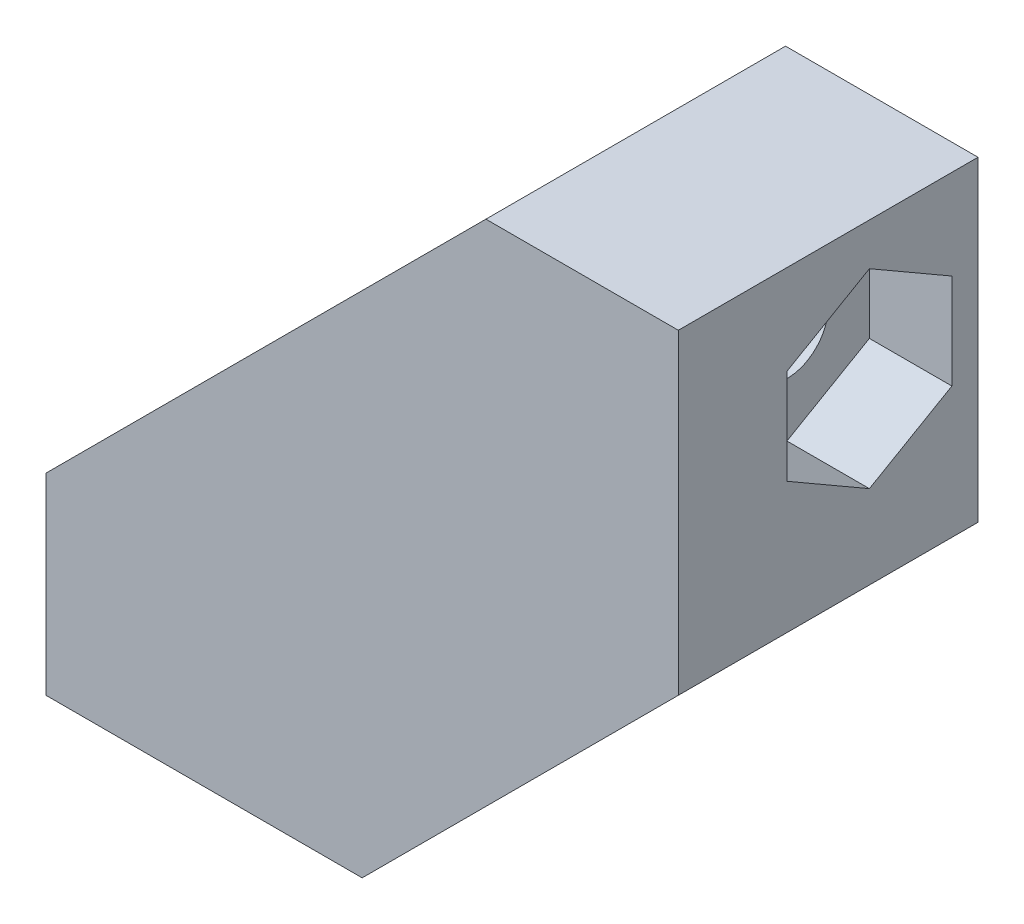
ISO-10303-21;
HEADER;
FILE_DESCRIPTION(('STEP AP214'),'2;1');
FILE_NAME('part.step','',(''),(''),'','','');
FILE_SCHEMA(('AUTOMOTIVE_DESIGN { 1 0 10303 214 1 1 1 1 }'));
ENDSEC;
DATA;
#1=APPLICATION_CONTEXT('core data for automotive mechanical design processes');
#2=APPLICATION_PROTOCOL_DEFINITION('international standard','automotive_design',2000,#1);
#3=PRODUCT_CONTEXT('',#1,'mechanical');
#4=PRODUCT('Part','Part','',(#3));
#5=PRODUCT_RELATED_PRODUCT_CATEGORY('part','',(#4));
#6=PRODUCT_DEFINITION_FORMATION('','',#4);
#7=PRODUCT_DEFINITION_CONTEXT('part definition',#1,'design');
#8=PRODUCT_DEFINITION('design','',#6,#7);
#9=PRODUCT_DEFINITION_SHAPE('','',#8);
#10=(LENGTH_UNIT() NAMED_UNIT(*) SI_UNIT(.MILLI.,.METRE.));
#11=(NAMED_UNIT(*) PLANE_ANGLE_UNIT() SI_UNIT($,.RADIAN.));
#12=(NAMED_UNIT(*) SI_UNIT($,.STERADIAN.) SOLID_ANGLE_UNIT());
#13=UNCERTAINTY_MEASURE_WITH_UNIT(LENGTH_MEASURE(1.E-05),#10,'distance_accuracy_value','');
#14=(GEOMETRIC_REPRESENTATION_CONTEXT(3) GLOBAL_UNCERTAINTY_ASSIGNED_CONTEXT((#13)) GLOBAL_UNIT_ASSIGNED_CONTEXT((#10,
#11,#12)) REPRESENTATION_CONTEXT('',''));
#15=CARTESIAN_POINT('',(0.,0.,0.));
#16=DIRECTION('',(0.,0.,1.));
#17=DIRECTION('',(1.,0.,0.));
#18=AXIS2_PLACEMENT_3D('',#15,#16,#17);
#19=CARTESIAN_POINT('',(22.,11.,-3.95));
#20=DIRECTION('',(1.,0.,0.));
#21=DIRECTION('',(0.,1.,0.));
#22=AXIS2_PLACEMENT_3D('',#19,#20,#21);
#23=CYLINDRICAL_SURFACE('',#22,1.5);
#24=CARTESIAN_POINT('',(38.,11.,-3.95));
#25=DIRECTION('',(1.,0.,0.));
#26=DIRECTION('',(0.,0.,-1.));
#27=AXIS2_PLACEMENT_3D('',#24,#25,#26);
#28=CIRCLE('',#27,1.5);
#29=CARTESIAN_POINT('',(38.,12.5,-3.95));
#30=VERTEX_POINT('',#29);
#31=EDGE_CURVE('E275',#30,#30,#28,.F.);
#32=CARTESIAN_POINT('',(42.,11.,-3.95));
#33=DIRECTION('',(1.,0.,0.));
#34=DIRECTION('',(0.,1.,0.));
#35=AXIS2_PLACEMENT_3D('',#32,#33,#34);
#36=CIRCLE('',#35,1.5);
#37=CARTESIAN_POINT('',(42.,12.5,-3.95));
#38=VERTEX_POINT('',#37);
#39=EDGE_CURVE('E270',#38,#38,#36,.T.);
#40=CARTESIAN_POINT('',(38.,12.5,-3.95));
#41=CARTESIAN_POINT('',(38.0416666666667,12.5,-3.95));
#42=CARTESIAN_POINT('',(38.0833333333333,12.5,-3.95));
#43=CARTESIAN_POINT('',(38.1666666666667,12.5,-3.95));
#44=CARTESIAN_POINT('',(38.2083333333333,12.5,-3.95));
#45=CARTESIAN_POINT('',(38.2916666666667,12.5,-3.95));
#46=CARTESIAN_POINT('',(38.3333333333333,12.5,-3.95));
#47=CARTESIAN_POINT('',(38.4166666666667,12.5,-3.95));
#48=CARTESIAN_POINT('',(38.4583333333333,12.5,-3.95));
#49=CARTESIAN_POINT('',(38.5416666666667,12.5,-3.95));
#50=CARTESIAN_POINT('',(38.5833333333333,12.5,-3.95));
#51=CARTESIAN_POINT('',(38.6666666666667,12.5,-3.95));
#52=CARTESIAN_POINT('',(38.7083333333333,12.5,-3.95));
#53=CARTESIAN_POINT('',(38.7916666666667,12.5,-3.95));
#54=CARTESIAN_POINT('',(38.8333333333333,12.5,-3.95));
#55=CARTESIAN_POINT('',(38.9166666666667,12.5,-3.95));
#56=CARTESIAN_POINT('',(38.9583333333333,12.5,-3.95));
#57=CARTESIAN_POINT('',(39.0416666666667,12.5,-3.95));
#58=CARTESIAN_POINT('',(39.0833333333333,12.5,-3.95));
#59=CARTESIAN_POINT('',(39.1666666666667,12.5,-3.95));
#60=CARTESIAN_POINT('',(39.2083333333333,12.5,-3.95));
#61=CARTESIAN_POINT('',(39.2916666666667,12.5,-3.95));
#62=CARTESIAN_POINT('',(39.3333333333333,12.5,-3.95));
#63=CARTESIAN_POINT('',(39.4166666666667,12.5,-3.95));
#64=CARTESIAN_POINT('',(39.4583333333333,12.5,-3.95));
#65=CARTESIAN_POINT('',(39.5416666666667,12.5,-3.95));
#66=CARTESIAN_POINT('',(39.5833333333333,12.5,-3.95));
#67=CARTESIAN_POINT('',(39.6666666666667,12.5,-3.95));
#68=CARTESIAN_POINT('',(39.7083333333333,12.5,-3.95));
#69=CARTESIAN_POINT('',(39.7916666666667,12.5,-3.95));
#70=CARTESIAN_POINT('',(39.8333333333333,12.5,-3.95));
#71=CARTESIAN_POINT('',(39.9166666666667,12.5,-3.95));
#72=CARTESIAN_POINT('',(39.9583333333333,12.5,-3.95));
#73=CARTESIAN_POINT('',(40.0416666666667,12.5,-3.95));
#74=CARTESIAN_POINT('',(40.0833333333333,12.5,-3.95));
#75=CARTESIAN_POINT('',(40.1666666666667,12.5,-3.95));
#76=CARTESIAN_POINT('',(40.2083333333333,12.5,-3.95));
#77=CARTESIAN_POINT('',(40.2916666666667,12.5,-3.95));
#78=CARTESIAN_POINT('',(40.3333333333333,12.5,-3.95));
#79=CARTESIAN_POINT('',(40.4166666666667,12.5,-3.95));
#80=CARTESIAN_POINT('',(40.4583333333333,12.5,-3.95));
#81=CARTESIAN_POINT('',(40.5416666666667,12.5,-3.95));
#82=CARTESIAN_POINT('',(40.5833333333333,12.5,-3.95));
#83=CARTESIAN_POINT('',(40.6666666666667,12.5,-3.95));
#84=CARTESIAN_POINT('',(40.7083333333333,12.5,-3.95));
#85=CARTESIAN_POINT('',(40.7916666666667,12.5,-3.95));
#86=CARTESIAN_POINT('',(40.8333333333333,12.5,-3.95));
#87=CARTESIAN_POINT('',(40.9166666666667,12.5,-3.95));
#88=CARTESIAN_POINT('',(40.9583333333333,12.5,-3.95));
#89=CARTESIAN_POINT('',(41.0416666666667,12.5,-3.95));
#90=CARTESIAN_POINT('',(41.0833333333333,12.5,-3.95));
#91=CARTESIAN_POINT('',(41.1666666666667,12.5,-3.95));
#92=CARTESIAN_POINT('',(41.2083333333333,12.5,-3.95));
#93=CARTESIAN_POINT('',(41.2916666666667,12.5,-3.95));
#94=CARTESIAN_POINT('',(41.3333333333333,12.5,-3.95));
#95=CARTESIAN_POINT('',(41.4166666666667,12.5,-3.95));
#96=CARTESIAN_POINT('',(41.4583333333333,12.5,-3.95));
#97=CARTESIAN_POINT('',(41.5416666666667,12.5,-3.95));
#98=CARTESIAN_POINT('',(41.5833333333333,12.5,-3.95));
#99=CARTESIAN_POINT('',(41.6666666666666,12.5,-3.95));
#100=CARTESIAN_POINT('',(41.7083333333333,12.5,-3.95));
#101=CARTESIAN_POINT('',(41.7916666666666,12.5,-3.95));
#102=CARTESIAN_POINT('',(41.8333333333333,12.5,-3.95));
#103=CARTESIAN_POINT('',(41.9166666666666,12.5,-3.95));
#104=CARTESIAN_POINT('',(41.9583333333333,12.5,-3.95));
#105=CARTESIAN_POINT('',(42.,12.5,-3.95));
#106=B_SPLINE_CURVE_WITH_KNOTS('',3,(#40,#41,#42,#43,#44,#45,#46,#47,#48,#49,#50,#51,#52,#53,
#54,#55,#56,#57,#58,#59,#60,#61,#62,#63,#64,#65,#66,#67,#68,#69,#70,#71,#72,#73,#74,#75,#76,#77,
#78,#79,#80,#81,#82,#83,#84,#85,#86,#87,#88,#89,#90,#91,#92,#93,#94,#95,#96,#97,#98,#99,#100,
#101,#102,#103,#104,#105),.UNSPECIFIED.,.F.,.F.,(4,2,2,2,2,2,2,2,2,2,2,2,2,2,2,2,2,2,2,2,2,2,2,
2,2,2,2,2,2,2,2,2,4),(0.,0.125,0.25,0.374999999999993,0.499999999999994,0.624999999999994,
0.749999999999994,0.874999999999994,0.999999999999994,1.12499999999999,1.24999999999999,
1.37499999999999,1.49999999999999,1.62499999999999,1.74999999999999,1.87499999999999,
1.99999999999999,2.12499999999999,2.24999999999999,2.37499999999998,2.49999999999998,
2.62499999999998,2.74999999999998,2.87499999999998,2.99999999999998,3.12499999999998,
3.24999999999998,3.37499999999998,3.49999999999998,3.62499999999998,3.74999999999998,
3.87499999999998,3.99999999999998),.UNSPECIFIED.);
#107=EDGE_CURVE('BSEAM36',#30,#38,#106,.T.);
#108=ORIENTED_EDGE('',*,*,#31,.T.);
#109=ORIENTED_EDGE('',*,*,#39,.T.);
#110=ORIENTED_EDGE('',*,*,#107,.T.);
#111=ORIENTED_EDGE('',*,*,#107,.F.);
#112=EDGE_LOOP('',(#108,#110,#109,#111));
#113=FACE_BOUND('',#112,.T.);
#114=ADVANCED_FACE('F36',(#113),#23,.F.);
#115=CARTESIAN_POINT('',(0.,0.,-7.9));
#116=DIRECTION('',(0.,0.,-1.));
#117=DIRECTION('',(-1.,0.,0.));
#118=AXIS2_PLACEMENT_3D('',#115,#116,#117);
#119=PLANE('',#118);
#120=DIRECTION('',(1.,0.,0.));
#121=VECTOR('',#120,1.);
#122=CARTESIAN_POINT('',(38.,4.61547220785406,-7.9));
#123=LINE('',#122,#121);
#124=CARTESIAN_POINT('',(33.3845277921459,4.61547220785406,-7.9));
#125=VERTEX_POINT('',#124);
#126=CARTESIAN_POINT('',(38.,4.61547220785406,-7.9));
#127=VERTEX_POINT('',#126);
#128=EDGE_CURVE('E390',#125,#127,#123,.T.);
#129=ORIENTED_EDGE('',*,*,#128,.T.);
#130=DIRECTION('',(0.,1.,0.));
#131=VECTOR('',#130,1.);
#132=CARTESIAN_POINT('',(38.,0.,-7.9));
#133=LINE('',#132,#131);
#134=CARTESIAN_POINT('',(38.,16.,-7.9));
#135=VERTEX_POINT('',#134);
#136=EDGE_CURVE('E61',#127,#135,#133,.T.);
#137=ORIENTED_EDGE('',*,*,#136,.T.);
#138=DIRECTION('',(1.,0.,0.));
#139=VECTOR('',#138,1.);
#140=CARTESIAN_POINT('',(0.,16.,-7.9));
#141=LINE('',#140,#139);
#142=CARTESIAN_POINT('',(45.,16.,-7.9));
#143=VERTEX_POINT('',#142);
#144=EDGE_CURVE('E354',#135,#143,#141,.T.);
#145=ORIENTED_EDGE('',*,*,#144,.T.);
#146=DIRECTION('',(0.,1.,0.));
#147=VECTOR('',#146,1.);
#148=CARTESIAN_POINT('',(45.,0.,-7.9));
#149=LINE('',#148,#147);
#150=CARTESIAN_POINT('',(45.,4.5,-7.9));
#151=VERTEX_POINT('',#150);
#152=EDGE_CURVE('E367',#151,#143,#149,.T.);
#153=ORIENTED_EDGE('',*,*,#152,.F.);
#154=DIRECTION('',(0.707106781186548,0.707106781186548,0.));
#155=VECTOR('',#154,1.);
#156=CARTESIAN_POINT('',(20.25,-20.25,-7.9));
#157=LINE('',#156,#155);
#158=CARTESIAN_POINT('',(33.5,-6.99999999999999,-7.9));
#159=VERTEX_POINT('',#158);
#160=EDGE_CURVE('E350',#159,#151,#157,.T.);
#161=ORIENTED_EDGE('',*,*,#160,.F.);
#162=DIRECTION('',(-1.,0.,0.));
#163=VECTOR('',#162,1.);
#164=CARTESIAN_POINT('',(0.,-7.,-7.9));
#165=LINE('',#164,#163);
#166=CARTESIAN_POINT('',(22.,-7.,-7.9));
#167=VERTEX_POINT('',#166);
#168=EDGE_CURVE('E349',#159,#167,#165,.T.);
#169=ORIENTED_EDGE('',*,*,#168,.T.);
#170=DIRECTION('',(0.,-1.,0.));
#171=VECTOR('',#170,1.);
#172=CARTESIAN_POINT('',(22.,0.,-7.9));
#173=LINE('',#172,#171);
#174=CARTESIAN_POINT('',(22.,0.,-7.9));
#175=VERTEX_POINT('',#174);
#176=EDGE_CURVE('E356',#175,#167,#173,.T.);
#177=ORIENTED_EDGE('',*,*,#176,.F.);
#178=DIRECTION('',(-1.,0.,0.));
#179=VECTOR('',#178,1.);
#180=CARTESIAN_POINT('',(0.,0.,-7.9));
#181=LINE('',#180,#179);
#182=CARTESIAN_POINT('',(33.3845277921459,0.,-7.9));
#183=VERTEX_POINT('',#182);
#184=EDGE_CURVE('E361',#183,#175,#181,.T.);
#185=ORIENTED_EDGE('',*,*,#184,.F.);
#186=DIRECTION('',(0.,1.,0.));
#187=VECTOR('',#186,1.);
#188=CARTESIAN_POINT('',(33.3845277921459,0.,-7.9));
#189=LINE('',#188,#187);
#190=EDGE_CURVE('E388',#183,#125,#189,.T.);
#191=ORIENTED_EDGE('',*,*,#190,.T.);
#192=EDGE_LOOP('',(#129,#137,#145,#153,#161,#169,#177,#185,#191));
#193=FACE_BOUND('',#192,.T.);
#194=ADVANCED_FACE('F395',(#193),#119,.T.);
#195=CARTESIAN_POINT('',(22.,0.,3.));
#196=DIRECTION('',(0.707106781186548,-0.707106781186547,0.));
#197=DIRECTION('',(0.707106781186547,0.707106781186548,0.));
#198=AXIS2_PLACEMENT_3D('',#195,#196,#197);
#199=PLANE('',#198);
#200=DIRECTION('',(0.,0.,-1.));
#201=VECTOR('',#200,1.);
#202=CARTESIAN_POINT('',(38.,16.,3.));
#203=LINE('',#202,#201);
#204=CARTESIAN_POINT('',(38.,16.,3.));
#205=VERTEX_POINT('',#204);
#206=CARTESIAN_POINT('',(38.,16.,0.3));
#207=VERTEX_POINT('',#206);
#208=EDGE_CURVE('E298',#205,#207,#203,.T.);
#209=ORIENTED_EDGE('',*,*,#208,.T.);
#210=DIRECTION('',(0.707106781186547,0.707106781186548,0.));
#211=VECTOR('',#210,1.);
#212=CARTESIAN_POINT('',(22.,0.,0.3));
#213=LINE('',#212,#211);
#214=CARTESIAN_POINT('',(22.,0.,0.3));
#215=VERTEX_POINT('',#214);
#216=EDGE_CURVE('E220',#215,#207,#213,.T.);
#217=ORIENTED_EDGE('',*,*,#216,.F.);
#218=DIRECTION('',(0.,0.,-1.));
#219=VECTOR('',#218,1.);
#220=CARTESIAN_POINT('',(22.,0.,3.));
#221=LINE('',#220,#219);
#222=CARTESIAN_POINT('',(22.,0.,3.));
#223=VERTEX_POINT('',#222);
#224=EDGE_CURVE('E295',#223,#215,#221,.T.);
#225=ORIENTED_EDGE('',*,*,#224,.F.);
#226=DIRECTION('',(-0.707106781186547,-0.707106781186548,0.));
#227=VECTOR('',#226,1.);
#228=CARTESIAN_POINT('',(22.,0.,3.));
#229=LINE('',#228,#227);
#230=EDGE_CURVE('E293',#205,#223,#229,.T.);
#231=ORIENTED_EDGE('',*,*,#230,.F.);
#232=EDGE_LOOP('',(#209,#217,#225,#231));
#233=FACE_BOUND('',#232,.T.);
#234=ADVANCED_FACE('F411',(#233),#199,.F.);
#235=CARTESIAN_POINT('',(0.,-7.,-40.4269119345812));
#236=DIRECTION('',(0.,1.,0.));
#237=DIRECTION('',(-1.,0.,0.));
#238=AXIS2_PLACEMENT_3D('',#235,#236,#237);
#239=PLANE('',#238);
#240=ORIENTED_EDGE('',*,*,#168,.F.);
#241=DIRECTION('',(0.,0.,1.));
#242=VECTOR('',#241,1.);
#243=CARTESIAN_POINT('',(33.5,-7.,-40.4269119345812));
#244=LINE('',#243,#242);
#245=CARTESIAN_POINT('',(33.5,-7.,3.));
#246=VERTEX_POINT('',#245);
#247=EDGE_CURVE('E372',#159,#246,#244,.T.);
#248=ORIENTED_EDGE('',*,*,#247,.T.);
#249=DIRECTION('',(1.,0.,0.));
#250=VECTOR('',#249,1.);
#251=CARTESIAN_POINT('',(22.,-7.,3.));
#252=LINE('',#251,#250);
#253=CARTESIAN_POINT('',(22.,-7.,3.));
#254=VERTEX_POINT('',#253);
#255=EDGE_CURVE('E282',#254,#246,#252,.T.);
#256=ORIENTED_EDGE('',*,*,#255,.F.);
#257=DIRECTION('',(0.,0.,1.));
#258=VECTOR('',#257,1.);
#259=CARTESIAN_POINT('',(22.,-7.,-40.4269119345812));
#260=LINE('',#259,#258);
#261=EDGE_CURVE('E359',#167,#254,#260,.T.);
#262=ORIENTED_EDGE('',*,*,#261,.F.);
#263=EDGE_LOOP('',(#240,#248,#256,#262));
#264=FACE_BOUND('',#263,.T.);
#265=DIRECTION('',(1.,0.,0.));
#266=VECTOR('',#265,1.);
#267=CARTESIAN_POINT('',(28.7320508075689,-7.,-0.950000000000001));
#268=LINE('',#267,#266);
#269=CARTESIAN_POINT('',(25.2679491924311,-7.,-0.95));
#270=VERTEX_POINT('',#269);
#271=CARTESIAN_POINT('',(28.7320508075689,-7.,-0.950000000000001));
#272=VERTEX_POINT('',#271);
#273=EDGE_CURVE('E300',#270,#272,#268,.T.);
#274=ORIENTED_EDGE('',*,*,#273,.T.);
#275=DIRECTION('',(0.500000000000001,0.,-0.866025403784438));
#276=VECTOR('',#275,1.);
#277=CARTESIAN_POINT('',(30.4641016151378,-7.,-3.95));
#278=LINE('',#277,#276);
#279=CARTESIAN_POINT('',(30.4641016151378,-7.,-3.95));
#280=VERTEX_POINT('',#279);
#281=EDGE_CURVE('E318',#272,#280,#278,.T.);
#282=ORIENTED_EDGE('',*,*,#281,.T.);
#283=DIRECTION('',(-0.5,0.,-0.866025403784439));
#284=VECTOR('',#283,1.);
#285=CARTESIAN_POINT('',(28.7320508075689,-7.,-6.95));
#286=LINE('',#285,#284);
#287=CARTESIAN_POINT('',(28.7320508075689,-7.,-6.95));
#288=VERTEX_POINT('',#287);
#289=EDGE_CURVE('E321',#280,#288,#286,.T.);
#290=ORIENTED_EDGE('',*,*,#289,.T.);
#291=DIRECTION('',(-1.,0.,0.));
#292=VECTOR('',#291,1.);
#293=CARTESIAN_POINT('',(25.2679491924311,-7.,-6.95));
#294=LINE('',#293,#292);
#295=CARTESIAN_POINT('',(25.2679491924311,-7.,-6.95));
#296=VERTEX_POINT('',#295);
#297=EDGE_CURVE('E324',#288,#296,#294,.T.);
#298=ORIENTED_EDGE('',*,*,#297,.T.);
#299=DIRECTION('',(-0.500000000000001,0.,0.866025403784438));
#300=VECTOR('',#299,1.);
#301=CARTESIAN_POINT('',(23.5358983848622,-7.,-3.95));
#302=LINE('',#301,#300);
#303=CARTESIAN_POINT('',(23.5358983848622,-7.,-3.95));
#304=VERTEX_POINT('',#303);
#305=EDGE_CURVE('E327',#296,#304,#302,.T.);
#306=ORIENTED_EDGE('',*,*,#305,.T.);
#307=DIRECTION('',(0.5,0.,0.866025403784439));
#308=VECTOR('',#307,1.);
#309=CARTESIAN_POINT('',(25.2679491924311,-7.,-0.950000000000001));
#310=LINE('',#309,#308);
#311=EDGE_CURVE('E305',#304,#270,#310,.T.);
#312=ORIENTED_EDGE('',*,*,#311,.T.);
#313=EDGE_LOOP('',(#274,#282,#290,#298,#306,#312));
#314=FACE_BOUND('',#313,.T.);
#315=ADVANCED_FACE('F429',(#264,#314),#239,.F.);
#316=CARTESIAN_POINT('',(27.,16.,-3.95));
#317=DIRECTION('',(0.,-1.,0.));
#318=DIRECTION('',(1.,0.,0.));
#319=AXIS2_PLACEMENT_3D('',#316,#317,#318);
#320=CYLINDRICAL_SURFACE('',#319,1.5);
#321=CARTESIAN_POINT('',(27.,0.,-3.95));
#322=DIRECTION('',(0.,1.,0.));
#323=DIRECTION('',(0.,0.,1.));
#324=AXIS2_PLACEMENT_3D('',#321,#322,#323);
#325=CIRCLE('',#324,1.5);
#326=CARTESIAN_POINT('',(27.,0.,-2.45));
#327=VERTEX_POINT('',#326);
#328=EDGE_CURVE('E346',#327,#327,#325,.T.);
#329=ORIENTED_EDGE('',*,*,#328,.T.);
#330=EDGE_LOOP('',(#329));
#331=FACE_BOUND('',#330,.T.);
#332=CARTESIAN_POINT('',(27.,-4.,-3.95));
#333=DIRECTION('',(0.,-1.,0.));
#334=DIRECTION('',(1.,0.,0.));
#335=AXIS2_PLACEMENT_3D('',#332,#333,#334);
#336=CIRCLE('',#335,1.5);
#337=CARTESIAN_POINT('',(28.5,-4.,-3.95));
#338=VERTEX_POINT('',#337);
#339=EDGE_CURVE('E345',#338,#338,#336,.F.);
#340=ORIENTED_EDGE('',*,*,#339,.F.);
#341=EDGE_LOOP('',(#340));
#342=FACE_BOUND('',#341,.T.);
#343=ADVANCED_FACE('F521',(#331,#342),#320,.F.);
#344=CARTESIAN_POINT('',(20.25,-20.25,-40.4269119345812));
#345=DIRECTION('',(0.707106781186548,-0.707106781186548,0.));
#346=DIRECTION('',(0.707106781186548,0.707106781186548,0.));
#347=AXIS2_PLACEMENT_3D('',#344,#345,#346);
#348=PLANE('',#347);
#349=ORIENTED_EDGE('',*,*,#247,.F.);
#350=ORIENTED_EDGE('',*,*,#160,.T.);
#351=DIRECTION('',(0.,0.,1.));
#352=VECTOR('',#351,1.);
#353=CARTESIAN_POINT('',(45.,4.5,-40.4269119345812));
#354=LINE('',#353,#352);
#355=CARTESIAN_POINT('',(45.,4.5,3.));
#356=VERTEX_POINT('',#355);
#357=EDGE_CURVE('E353',#151,#356,#354,.T.);
#358=ORIENTED_EDGE('',*,*,#357,.T.);
#359=DIRECTION('',(0.707106781186547,0.707106781186548,0.));
#360=VECTOR('',#359,1.);
#361=CARTESIAN_POINT('',(33.5,-7.,3.));
#362=LINE('',#361,#360);
#363=EDGE_CURVE('E285',#246,#356,#362,.T.);
#364=ORIENTED_EDGE('',*,*,#363,.F.);
#365=EDGE_LOOP('',(#349,#350,#358,#364));
#366=FACE_BOUND('',#365,.T.);
#367=ADVANCED_FACE('F426',(#366),#348,.T.);
#368=CARTESIAN_POINT('',(45.,0.,-40.4269119345812));
#369=DIRECTION('',(1.,0.,0.));
#370=DIRECTION('',(0.,0.,-1.));
#371=AXIS2_PLACEMENT_3D('',#368,#369,#370);
#372=PLANE('',#371);
#373=DIRECTION('',(0.,-1.,0.));
#374=VECTOR('',#373,1.);
#375=CARTESIAN_POINT('',(45.,9.26794919243114,-0.950000000000001));
#376=LINE('',#375,#374);
#377=CARTESIAN_POINT('',(45.,12.7320508075689,-0.950000000000001));
#378=VERTEX_POINT('',#377);
#379=CARTESIAN_POINT('',(45.,9.26794919243115,-0.95));
#380=VERTEX_POINT('',#379);
#381=EDGE_CURVE('E208',#378,#380,#376,.T.);
#382=ORIENTED_EDGE('',*,*,#381,.F.);
#383=DIRECTION('',(0.,-0.5,0.866025403784439));
#384=VECTOR('',#383,1.);
#385=CARTESIAN_POINT('',(45.,12.7320508075689,-0.950000000000001));
#386=LINE('',#385,#384);
#387=CARTESIAN_POINT('',(45.,14.4641016151378,-3.95));
#388=VERTEX_POINT('',#387);
#389=EDGE_CURVE('E244',#388,#378,#386,.T.);
#390=ORIENTED_EDGE('',*,*,#389,.F.);
#391=DIRECTION('',(0.,0.500000000000001,0.866025403784438));
#392=VECTOR('',#391,1.);
#393=CARTESIAN_POINT('',(45.,14.4641016151378,-3.95));
#394=LINE('',#393,#392);
#395=CARTESIAN_POINT('',(45.,12.7320508075689,-6.95));
#396=VERTEX_POINT('',#395);
#397=EDGE_CURVE('E247',#396,#388,#394,.T.);
#398=ORIENTED_EDGE('',*,*,#397,.F.);
#399=DIRECTION('',(0.,1.,0.));
#400=VECTOR('',#399,1.);
#401=CARTESIAN_POINT('',(45.,12.7320508075689,-6.95));
#402=LINE('',#401,#400);
#403=CARTESIAN_POINT('',(45.,9.26794919243114,-6.95));
#404=VERTEX_POINT('',#403);
#405=EDGE_CURVE('E250',#404,#396,#402,.T.);
#406=ORIENTED_EDGE('',*,*,#405,.F.);
#407=DIRECTION('',(0.,0.5,-0.866025403784439));
#408=VECTOR('',#407,1.);
#409=CARTESIAN_POINT('',(45.,9.26794919243114,-6.95));
#410=LINE('',#409,#408);
#411=CARTESIAN_POINT('',(45.,7.53589838486226,-3.95));
#412=VERTEX_POINT('',#411);
#413=EDGE_CURVE('E253',#412,#404,#410,.T.);
#414=ORIENTED_EDGE('',*,*,#413,.F.);
#415=DIRECTION('',(0.,-0.500000000000001,-0.866025403784438));
#416=VECTOR('',#415,1.);
#417=CARTESIAN_POINT('',(45.,7.53589838486226,-3.95));
#418=LINE('',#417,#416);
#419=EDGE_CURVE('E227',#380,#412,#418,.T.);
#420=ORIENTED_EDGE('',*,*,#419,.F.);
#421=EDGE_LOOP('',(#382,#390,#398,#406,#414,#420));
#422=FACE_BOUND('',#421,.T.);
#423=ORIENTED_EDGE('',*,*,#357,.F.);
#424=ORIENTED_EDGE('',*,*,#152,.T.);
#425=DIRECTION('',(0.,0.,1.));
#426=VECTOR('',#425,1.);
#427=CARTESIAN_POINT('',(45.,16.,-40.4269119345812));
#428=LINE('',#427,#426);
#429=CARTESIAN_POINT('',(45.,16.,3.));
#430=VERTEX_POINT('',#429);
#431=EDGE_CURVE('E370',#143,#430,#428,.T.);
#432=ORIENTED_EDGE('',*,*,#431,.T.);
#433=DIRECTION('',(0.,1.,0.));
#434=VECTOR('',#433,1.);
#435=CARTESIAN_POINT('',(45.,4.5,3.));
#436=LINE('',#435,#434);
#437=EDGE_CURVE('E288',#356,#430,#436,.T.);
#438=ORIENTED_EDGE('',*,*,#437,.F.);
#439=EDGE_LOOP('',(#423,#424,#432,#438));
#440=FACE_BOUND('',#439,.T.);
#441=ADVANCED_FACE('F422',(#422,#440),#372,.T.);
#442=CARTESIAN_POINT('',(0.,16.,-40.4269119345812));
#443=DIRECTION('',(0.,-1.,0.));
#444=DIRECTION('',(0.,0.,-1.));
#445=AXIS2_PLACEMENT_3D('',#442,#443,#444);
#446=PLANE('',#445);
#447=ORIENTED_EDGE('',*,*,#144,.F.);
#448=DIRECTION('',(0.,0.,1.));
#449=VECTOR('',#448,1.);
#450=CARTESIAN_POINT('',(38.,16.,-40.4269119345812));
#451=LINE('',#450,#449);
#452=EDGE_CURVE('E364',#135,#207,#451,.T.);
#453=ORIENTED_EDGE('',*,*,#452,.T.);
#454=ORIENTED_EDGE('',*,*,#208,.F.);
#455=DIRECTION('',(-1.,0.,0.));
#456=VECTOR('',#455,1.);
#457=CARTESIAN_POINT('',(45.,16.,3.));
#458=LINE('',#457,#456);
#459=EDGE_CURVE('E291',#430,#205,#458,.T.);
#460=ORIENTED_EDGE('',*,*,#459,.F.);
#461=ORIENTED_EDGE('',*,*,#431,.F.);
#462=EDGE_LOOP('',(#447,#453,#454,#460,#461));
#463=FACE_BOUND('',#462,.T.);
#464=ADVANCED_FACE('F416',(#463),#446,.F.);
#465=CARTESIAN_POINT('',(38.,0.,-40.4269119345812));
#466=DIRECTION('',(1.,0.,0.));
#467=DIRECTION('',(0.,0.,-1.));
#468=AXIS2_PLACEMENT_3D('',#465,#466,#467);
#469=PLANE('',#468);
#470=ORIENTED_EDGE('',*,*,#31,.F.);
#471=EDGE_LOOP('',(#470));
#472=FACE_BOUND('',#471,.T.);
#473=ORIENTED_EDGE('',*,*,#136,.F.);
#474=DIRECTION('',(0.,0.838670567945423,0.544639035015029));
#475=VECTOR('',#474,1.);
#476=CARTESIAN_POINT('',(38.,-13.4883110565779,-19.6567343175242));
#477=LINE('',#476,#475);
#478=CARTESIAN_POINT('',(38.,7.69520213548322,-5.9));
#479=VERTEX_POINT('',#478);
#480=EDGE_CURVE('E46',#127,#479,#477,.T.);
#481=ORIENTED_EDGE('',*,*,#480,.T.);
#482=DIRECTION('',(0.,0.,-1.));
#483=VECTOR('',#482,1.);
#484=CARTESIAN_POINT('',(38.,7.69520213548322,-8.2));
#485=LINE('',#484,#483);
#486=CARTESIAN_POINT('',(38.,7.69520213548322,0.3));
#487=VERTEX_POINT('',#486);
#488=EDGE_CURVE('E202',#487,#479,#485,.T.);
#489=ORIENTED_EDGE('',*,*,#488,.F.);
#490=DIRECTION('',(0.,-1.,0.));
#491=VECTOR('',#490,1.);
#492=CARTESIAN_POINT('',(38.,16.,0.3));
#493=LINE('',#492,#491);
#494=EDGE_CURVE('E209',#207,#487,#493,.T.);
#495=ORIENTED_EDGE('',*,*,#494,.F.);
#496=ORIENTED_EDGE('',*,*,#452,.F.);
#497=EDGE_LOOP('',(#473,#481,#489,#495,#496));
#498=FACE_BOUND('',#497,.T.);
#499=ADVANCED_FACE('F212',(#472,#498),#469,.F.);
#500=CARTESIAN_POINT('',(0.,0.,-40.4269119345812));
#501=DIRECTION('',(0.,1.,0.));
#502=DIRECTION('',(0.,0.,1.));
#503=AXIS2_PLACEMENT_3D('',#500,#501,#502);
#504=PLANE('',#503);
#505=ORIENTED_EDGE('',*,*,#328,.F.);
#506=EDGE_LOOP('',(#505));
#507=FACE_BOUND('',#506,.T.);
#508=DIRECTION('',(0.,0.,-1.));
#509=VECTOR('',#508,1.);
#510=CARTESIAN_POINT('',(30.3047978645168,0.,-8.2));
#511=LINE('',#510,#509);
#512=CARTESIAN_POINT('',(30.3047978645168,0.,0.3));
#513=VERTEX_POINT('',#512);
#514=CARTESIAN_POINT('',(30.3047978645168,0.,-5.9));
#515=VERTEX_POINT('',#514);
#516=EDGE_CURVE('E274',#513,#515,#511,.T.);
#517=ORIENTED_EDGE('',*,*,#516,.T.);
#518=DIRECTION('',(-0.838670567945423,0.,0.544639035015028));
#519=VECTOR('',#518,1.);
#520=CARTESIAN_POINT('',(33.3845277921459,0.,-7.9));
#521=LINE('',#520,#519);
#522=EDGE_CURVE('E11',#515,#183,#521,.F.);
#523=ORIENTED_EDGE('',*,*,#522,.T.);
#524=ORIENTED_EDGE('',*,*,#184,.T.);
#525=DIRECTION('',(0.,0.,1.));
#526=VECTOR('',#525,1.);
#527=CARTESIAN_POINT('',(22.,0.,-40.4269119345812));
#528=LINE('',#527,#526);
#529=EDGE_CURVE('E360',#175,#215,#528,.T.);
#530=ORIENTED_EDGE('',*,*,#529,.T.);
#531=DIRECTION('',(1.,0.,0.));
#532=VECTOR('',#531,1.);
#533=CARTESIAN_POINT('',(22.,0.,0.3));
#534=LINE('',#533,#532);
#535=EDGE_CURVE('E271',#215,#513,#534,.T.);
#536=ORIENTED_EDGE('',*,*,#535,.T.);
#537=EDGE_LOOP('',(#517,#523,#524,#530,#536));
#538=FACE_BOUND('',#537,.T.);
#539=ADVANCED_FACE('F402',(#507,#538),#504,.T.);
#540=CARTESIAN_POINT('',(22.,0.,-40.4269119345812));
#541=DIRECTION('',(-1.,0.,0.));
#542=DIRECTION('',(0.,-1.,0.));
#543=AXIS2_PLACEMENT_3D('',#540,#541,#542);
#544=PLANE('',#543);
#545=ORIENTED_EDGE('',*,*,#529,.F.);
#546=ORIENTED_EDGE('',*,*,#176,.T.);
#547=ORIENTED_EDGE('',*,*,#261,.T.);
#548=DIRECTION('',(0.,-1.,0.));
#549=VECTOR('',#548,1.);
#550=CARTESIAN_POINT('',(22.,0.,3.));
#551=LINE('',#550,#549);
#552=EDGE_CURVE('E279',#223,#254,#551,.T.);
#553=ORIENTED_EDGE('',*,*,#552,.F.);
#554=ORIENTED_EDGE('',*,*,#224,.T.);
#555=EDGE_LOOP('',(#545,#546,#547,#553,#554));
#556=FACE_BOUND('',#555,.T.);
#557=ADVANCED_FACE('F406',(#556),#544,.T.);
#558=CARTESIAN_POINT('',(0.,-4.00000000000001,0.));
#559=DIRECTION('',(0.,-1.,0.));
#560=DIRECTION('',(1.,0.,0.));
#561=AXIS2_PLACEMENT_3D('',#558,#559,#560);
#562=PLANE('',#561);
#563=DIRECTION('',(1.,0.,0.));
#564=VECTOR('',#563,1.);
#565=CARTESIAN_POINT('',(28.7320508075689,-4.,-0.950000000000001));
#566=LINE('',#565,#564);
#567=CARTESIAN_POINT('',(25.2679491924311,-4.,-0.950000000000001));
#568=VERTEX_POINT('',#567);
#569=CARTESIAN_POINT('',(28.7320508075689,-4.,-0.950000000000001));
#570=VERTEX_POINT('',#569);
#571=EDGE_CURVE('E301',#568,#570,#566,.T.);
#572=ORIENTED_EDGE('',*,*,#571,.F.);
#573=DIRECTION('',(0.5,0.,0.866025403784439));
#574=VECTOR('',#573,1.);
#575=CARTESIAN_POINT('',(25.2679491924311,-4.,-0.950000000000001));
#576=LINE('',#575,#574);
#577=CARTESIAN_POINT('',(23.5358983848622,-4.,-3.95));
#578=VERTEX_POINT('',#577);
#579=EDGE_CURVE('E313',#578,#568,#576,.T.);
#580=ORIENTED_EDGE('',*,*,#579,.F.);
#581=DIRECTION('',(-0.500000000000001,0.,0.866025403784438));
#582=VECTOR('',#581,1.);
#583=CARTESIAN_POINT('',(23.5358983848622,-4.,-3.95));
#584=LINE('',#583,#582);
#585=CARTESIAN_POINT('',(25.2679491924311,-4.,-6.95));
#586=VERTEX_POINT('',#585);
#587=EDGE_CURVE('E311',#586,#578,#584,.T.);
#588=ORIENTED_EDGE('',*,*,#587,.F.);
#589=DIRECTION('',(-1.,0.,0.));
#590=VECTOR('',#589,1.);
#591=CARTESIAN_POINT('',(25.2679491924311,-4.,-6.95));
#592=LINE('',#591,#590);
#593=CARTESIAN_POINT('',(28.7320508075689,-4.,-6.95));
#594=VERTEX_POINT('',#593);
#595=EDGE_CURVE('E309',#594,#586,#592,.T.);
#596=ORIENTED_EDGE('',*,*,#595,.F.);
#597=DIRECTION('',(-0.5,0.,-0.866025403784439));
#598=VECTOR('',#597,1.);
#599=CARTESIAN_POINT('',(28.7320508075689,-4.,-6.95));
#600=LINE('',#599,#598);
#601=CARTESIAN_POINT('',(30.4641016151378,-4.,-3.95));
#602=VERTEX_POINT('',#601);
#603=EDGE_CURVE('E307',#602,#594,#600,.T.);
#604=ORIENTED_EDGE('',*,*,#603,.F.);
#605=DIRECTION('',(0.500000000000001,0.,-0.866025403784438));
#606=VECTOR('',#605,1.);
#607=CARTESIAN_POINT('',(30.4641016151378,-4.,-3.95));
#608=LINE('',#607,#606);
#609=EDGE_CURVE('E304',#570,#602,#608,.T.);
#610=ORIENTED_EDGE('',*,*,#609,.F.);
#611=EDGE_LOOP('',(#572,#580,#588,#596,#604,#610));
#612=FACE_BOUND('',#611,.T.);
#613=ORIENTED_EDGE('',*,*,#339,.T.);
#614=EDGE_LOOP('',(#613));
#615=FACE_BOUND('',#614,.T.);
#616=ADVANCED_FACE('F534',(#612,#615),#562,.T.);
#617=CARTESIAN_POINT('',(28.7320508075689,-4.,-0.950000000000001));
#618=DIRECTION('',(0.,0.,-1.));
#619=DIRECTION('',(-1.,0.,0.));
#620=AXIS2_PLACEMENT_3D('',#617,#618,#619);
#621=PLANE('',#620);
#622=ORIENTED_EDGE('',*,*,#273,.F.);
#623=DIRECTION('',(0.,-1.,0.));
#624=VECTOR('',#623,1.);
#625=CARTESIAN_POINT('',(25.2679491924311,-4.,-0.950000000000001));
#626=LINE('',#625,#624);
#627=EDGE_CURVE('E315',#568,#270,#626,.T.);
#628=ORIENTED_EDGE('',*,*,#627,.F.);
#629=ORIENTED_EDGE('',*,*,#571,.T.);
#630=DIRECTION('',(0.,-1.,0.));
#631=VECTOR('',#630,1.);
#632=CARTESIAN_POINT('',(28.7320508075689,-4.,-0.950000000000001));
#633=LINE('',#632,#631);
#634=EDGE_CURVE('E342',#570,#272,#633,.T.);
#635=ORIENTED_EDGE('',*,*,#634,.T.);
#636=EDGE_LOOP('',(#622,#628,#629,#635));
#637=FACE_BOUND('',#636,.T.);
#638=ADVANCED_FACE('F540',(#637),#621,.T.);
#639=CARTESIAN_POINT('',(30.4641016151378,-4.,-3.95));
#640=DIRECTION('',(-0.866025403784438,0.,-0.500000000000001));
#641=DIRECTION('',(-0.500000000000001,0.,0.866025403784438));
#642=AXIS2_PLACEMENT_3D('',#639,#640,#641);
#643=PLANE('',#642);
#644=ORIENTED_EDGE('',*,*,#281,.F.);
#645=ORIENTED_EDGE('',*,*,#634,.F.);
#646=ORIENTED_EDGE('',*,*,#609,.T.);
#647=DIRECTION('',(0.,-1.,0.));
#648=VECTOR('',#647,1.);
#649=CARTESIAN_POINT('',(30.4641016151378,-4.,-3.95));
#650=LINE('',#649,#648);
#651=EDGE_CURVE('E340',#602,#280,#650,.T.);
#652=ORIENTED_EDGE('',*,*,#651,.T.);
#653=EDGE_LOOP('',(#644,#645,#646,#652));
#654=FACE_BOUND('',#653,.T.);
#655=ADVANCED_FACE('F543',(#654),#643,.T.);
#656=CARTESIAN_POINT('',(28.7320508075689,-4.,-6.95));
#657=DIRECTION('',(-0.866025403784439,0.,0.5));
#658=DIRECTION('',(0.5,0.,0.866025403784439));
#659=AXIS2_PLACEMENT_3D('',#656,#657,#658);
#660=PLANE('',#659);
#661=ORIENTED_EDGE('',*,*,#289,.F.);
#662=ORIENTED_EDGE('',*,*,#651,.F.);
#663=ORIENTED_EDGE('',*,*,#603,.T.);
#664=DIRECTION('',(0.,-1.,0.));
#665=VECTOR('',#664,1.);
#666=CARTESIAN_POINT('',(28.7320508075689,-4.,-6.95));
#667=LINE('',#666,#665);
#668=EDGE_CURVE('E338',#594,#288,#667,.T.);
#669=ORIENTED_EDGE('',*,*,#668,.T.);
#670=EDGE_LOOP('',(#661,#662,#663,#669));
#671=FACE_BOUND('',#670,.T.);
#672=ADVANCED_FACE('F547',(#671),#660,.T.);
#673=CARTESIAN_POINT('',(25.2679491924311,-4.,-6.95));
#674=DIRECTION('',(0.,0.,1.));
#675=DIRECTION('',(1.,0.,0.));
#676=AXIS2_PLACEMENT_3D('',#673,#674,#675);
#677=PLANE('',#676);
#678=ORIENTED_EDGE('',*,*,#297,.F.);
#679=ORIENTED_EDGE('',*,*,#668,.F.);
#680=ORIENTED_EDGE('',*,*,#595,.T.);
#681=DIRECTION('',(0.,-1.,0.));
#682=VECTOR('',#681,1.);
#683=CARTESIAN_POINT('',(25.2679491924311,-4.,-6.95));
#684=LINE('',#683,#682);
#685=EDGE_CURVE('E336',#586,#296,#684,.T.);
#686=ORIENTED_EDGE('',*,*,#685,.T.);
#687=EDGE_LOOP('',(#678,#679,#680,#686));
#688=FACE_BOUND('',#687,.T.);
#689=ADVANCED_FACE('F551',(#688),#677,.T.);
#690=CARTESIAN_POINT('',(23.5358983848622,-4.,-3.95));
#691=DIRECTION('',(0.866025403784438,0.,0.500000000000001));
#692=DIRECTION('',(0.500000000000001,0.,-0.866025403784438));
#693=AXIS2_PLACEMENT_3D('',#690,#691,#692);
#694=PLANE('',#693);
#695=ORIENTED_EDGE('',*,*,#305,.F.);
#696=ORIENTED_EDGE('',*,*,#685,.F.);
#697=ORIENTED_EDGE('',*,*,#587,.T.);
#698=DIRECTION('',(0.,-1.,0.));
#699=VECTOR('',#698,1.);
#700=CARTESIAN_POINT('',(23.5358983848622,-4.,-3.95));
#701=LINE('',#700,#699);
#702=EDGE_CURVE('E334',#578,#304,#701,.T.);
#703=ORIENTED_EDGE('',*,*,#702,.T.);
#704=EDGE_LOOP('',(#695,#696,#697,#703));
#705=FACE_BOUND('',#704,.T.);
#706=ADVANCED_FACE('F442',(#705),#694,.T.);
#707=CARTESIAN_POINT('',(25.2679491924311,-4.,-0.950000000000001));
#708=DIRECTION('',(0.866025403784438,0.,-0.5));
#709=DIRECTION('',(-0.5,0.,-0.866025403784439));
#710=AXIS2_PLACEMENT_3D('',#707,#708,#709);
#711=PLANE('',#710);
#712=ORIENTED_EDGE('',*,*,#311,.F.);
#713=ORIENTED_EDGE('',*,*,#702,.F.);
#714=ORIENTED_EDGE('',*,*,#579,.T.);
#715=ORIENTED_EDGE('',*,*,#627,.T.);
#716=EDGE_LOOP('',(#712,#713,#714,#715));
#717=FACE_BOUND('',#716,.T.);
#718=ADVANCED_FACE('F435',(#717),#711,.T.);
#719=CARTESIAN_POINT('',(0.,0.,3.));
#720=DIRECTION('',(0.,0.,1.));
#721=DIRECTION('',(1.,0.,0.));
#722=AXIS2_PLACEMENT_3D('',#719,#720,#721);
#723=PLANE('',#722);
#724=ORIENTED_EDGE('',*,*,#552,.T.);
#725=ORIENTED_EDGE('',*,*,#255,.T.);
#726=ORIENTED_EDGE('',*,*,#363,.T.);
#727=ORIENTED_EDGE('',*,*,#437,.T.);
#728=ORIENTED_EDGE('',*,*,#459,.T.);
#729=ORIENTED_EDGE('',*,*,#230,.T.);
#730=EDGE_LOOP('',(#724,#725,#726,#727,#728,#729));
#731=FACE_BOUND('',#730,.T.);
#732=ADVANCED_FACE('F433',(#731),#723,.T.);
#733=CARTESIAN_POINT('',(22.,16.,0.3));
#734=DIRECTION('',(0.,0.,-1.));
#735=DIRECTION('',(-1.,0.,0.));
#736=AXIS2_PLACEMENT_3D('',#733,#734,#735);
#737=PLANE('',#736);
#738=ORIENTED_EDGE('',*,*,#216,.T.);
#739=ORIENTED_EDGE('',*,*,#494,.T.);
#740=DIRECTION('',(1.,0.,0.));
#741=VECTOR('',#740,1.);
#742=CARTESIAN_POINT('',(22.,7.6952021354832,0.3));
#743=LINE('',#742,#741);
#744=CARTESIAN_POINT('',(30.3047978645168,7.6952021354832,0.3));
#745=VERTEX_POINT('',#744);
#746=EDGE_CURVE('E198',#745,#487,#743,.T.);
#747=ORIENTED_EDGE('',*,*,#746,.F.);
#748=DIRECTION('',(0.,-1.,0.));
#749=VECTOR('',#748,1.);
#750=CARTESIAN_POINT('',(30.3047978645168,16.,0.3));
#751=LINE('',#750,#749);
#752=EDGE_CURVE('E277',#745,#513,#751,.T.);
#753=ORIENTED_EDGE('',*,*,#752,.T.);
#754=ORIENTED_EDGE('',*,*,#535,.F.);
#755=EDGE_LOOP('',(#738,#739,#747,#753,#754));
#756=FACE_BOUND('',#755,.T.);
#757=ADVANCED_FACE('F217',(#756),#737,.T.);
#758=CARTESIAN_POINT('',(30.3047978645168,16.,-8.2));
#759=DIRECTION('',(-1.,0.,0.));
#760=DIRECTION('',(0.,0.,1.));
#761=AXIS2_PLACEMENT_3D('',#758,#759,#760);
#762=PLANE('',#761);
#763=DIRECTION('',(0.,0.,1.));
#764=VECTOR('',#763,1.);
#765=CARTESIAN_POINT('',(30.3047978645168,7.69520213548321,-8.2));
#766=LINE('',#765,#764);
#767=CARTESIAN_POINT('',(30.3047978645168,7.69520213548321,-5.9));
#768=VERTEX_POINT('',#767);
#769=EDGE_CURVE('E204',#768,#745,#766,.T.);
#770=ORIENTED_EDGE('',*,*,#769,.F.);
#771=DIRECTION('',(0.,-1.,0.));
#772=VECTOR('',#771,1.);
#773=CARTESIAN_POINT('',(30.3047978645168,16.,-5.9));
#774=LINE('',#773,#772);
#775=EDGE_CURVE('E53',#768,#515,#774,.T.);
#776=ORIENTED_EDGE('',*,*,#775,.T.);
#777=ORIENTED_EDGE('',*,*,#516,.F.);
#778=ORIENTED_EDGE('',*,*,#752,.F.);
#779=EDGE_LOOP('',(#770,#776,#777,#778));
#780=FACE_BOUND('',#779,.T.);
#781=ADVANCED_FACE('F400',(#780),#762,.T.);
#782=CARTESIAN_POINT('',(42.,9.26794919243114,-0.950000000000001));
#783=DIRECTION('',(0.,0.,1.));
#784=DIRECTION('',(0.,-1.,0.));
#785=AXIS2_PLACEMENT_3D('',#782,#783,#784);
#786=PLANE('',#785);
#787=ORIENTED_EDGE('',*,*,#381,.T.);
#788=DIRECTION('',(1.,0.,0.));
#789=VECTOR('',#788,1.);
#790=CARTESIAN_POINT('',(42.,9.26794919243114,-0.950000000000001));
#791=LINE('',#790,#789);
#792=CARTESIAN_POINT('',(42.,9.26794919243114,-0.950000000000001));
#793=VERTEX_POINT('',#792);
#794=EDGE_CURVE('E242',#793,#380,#791,.T.);
#795=ORIENTED_EDGE('',*,*,#794,.F.);
#796=DIRECTION('',(0.,-1.,0.));
#797=VECTOR('',#796,1.);
#798=CARTESIAN_POINT('',(42.,9.26794919243114,-0.950000000000001));
#799=LINE('',#798,#797);
#800=CARTESIAN_POINT('',(42.,12.7320508075689,-0.950000000000001));
#801=VERTEX_POINT('',#800);
#802=EDGE_CURVE('E223',#801,#793,#799,.T.);
#803=ORIENTED_EDGE('',*,*,#802,.F.);
#804=DIRECTION('',(1.,0.,0.));
#805=VECTOR('',#804,1.);
#806=CARTESIAN_POINT('',(42.,12.7320508075689,-0.950000000000001));
#807=LINE('',#806,#805);
#808=EDGE_CURVE('E268',#801,#378,#807,.T.);
#809=ORIENTED_EDGE('',*,*,#808,.T.);
#810=EDGE_LOOP('',(#787,#795,#803,#809));
#811=FACE_BOUND('',#810,.T.);
#812=ADVANCED_FACE('F456',(#811),#786,.F.);
#813=CARTESIAN_POINT('',(42.,12.7320508075689,-0.950000000000001));
#814=DIRECTION('',(0.,0.866025403784438,0.5));
#815=DIRECTION('',(0.,-0.5,0.866025403784439));
#816=AXIS2_PLACEMENT_3D('',#813,#814,#815);
#817=PLANE('',#816);
#818=ORIENTED_EDGE('',*,*,#389,.T.);
#819=ORIENTED_EDGE('',*,*,#808,.F.);
#820=DIRECTION('',(0.,-0.5,0.866025403784439));
#821=VECTOR('',#820,1.);
#822=CARTESIAN_POINT('',(42.,12.7320508075689,-0.950000000000001));
#823=LINE('',#822,#821);
#824=CARTESIAN_POINT('',(42.,14.4641016151378,-3.95));
#825=VERTEX_POINT('',#824);
#826=EDGE_CURVE('E226',#825,#801,#823,.T.);
#827=ORIENTED_EDGE('',*,*,#826,.F.);
#828=DIRECTION('',(1.,0.,0.));
#829=VECTOR('',#828,1.);
#830=CARTESIAN_POINT('',(42.,14.4641016151378,-3.95));
#831=LINE('',#830,#829);
#832=EDGE_CURVE('E266',#825,#388,#831,.T.);
#833=ORIENTED_EDGE('',*,*,#832,.T.);
#834=EDGE_LOOP('',(#818,#819,#827,#833));
#835=FACE_BOUND('',#834,.T.);
#836=ADVANCED_FACE('F462',(#835),#817,.F.);
#837=CARTESIAN_POINT('',(42.,14.4641016151378,-3.95));
#838=DIRECTION('',(0.,0.866025403784438,-0.500000000000001));
#839=DIRECTION('',(0.,0.500000000000001,0.866025403784438));
#840=AXIS2_PLACEMENT_3D('',#837,#838,#839);
#841=PLANE('',#840);
#842=ORIENTED_EDGE('',*,*,#397,.T.);
#843=ORIENTED_EDGE('',*,*,#832,.F.);
#844=DIRECTION('',(0.,0.500000000000001,0.866025403784438));
#845=VECTOR('',#844,1.);
#846=CARTESIAN_POINT('',(42.,14.4641016151378,-3.95));
#847=LINE('',#846,#845);
#848=CARTESIAN_POINT('',(42.,12.7320508075689,-6.95));
#849=VERTEX_POINT('',#848);
#850=EDGE_CURVE('E230',#849,#825,#847,.T.);
#851=ORIENTED_EDGE('',*,*,#850,.F.);
#852=DIRECTION('',(1.,0.,0.));
#853=VECTOR('',#852,1.);
#854=CARTESIAN_POINT('',(42.,12.7320508075689,-6.95));
#855=LINE('',#854,#853);
#856=EDGE_CURVE('E264',#849,#396,#855,.T.);
#857=ORIENTED_EDGE('',*,*,#856,.T.);
#858=EDGE_LOOP('',(#842,#843,#851,#857));
#859=FACE_BOUND('',#858,.T.);
#860=ADVANCED_FACE('F467',(#859),#841,.F.);
#861=CARTESIAN_POINT('',(42.,12.7320508075689,-6.95));
#862=DIRECTION('',(0.,0.,-1.));
#863=DIRECTION('',(0.,1.,0.));
#864=AXIS2_PLACEMENT_3D('',#861,#862,#863);
#865=PLANE('',#864);
#866=ORIENTED_EDGE('',*,*,#405,.T.);
#867=ORIENTED_EDGE('',*,*,#856,.F.);
#868=DIRECTION('',(0.,1.,0.));
#869=VECTOR('',#868,1.);
#870=CARTESIAN_POINT('',(42.,12.7320508075689,-6.95));
#871=LINE('',#870,#869);
#872=CARTESIAN_POINT('',(42.,9.26794919243114,-6.95));
#873=VERTEX_POINT('',#872);
#874=EDGE_CURVE('E233',#873,#849,#871,.T.);
#875=ORIENTED_EDGE('',*,*,#874,.F.);
#876=DIRECTION('',(1.,0.,0.));
#877=VECTOR('',#876,1.);
#878=CARTESIAN_POINT('',(42.,9.26794919243114,-6.95));
#879=LINE('',#878,#877);
#880=EDGE_CURVE('E262',#873,#404,#879,.T.);
#881=ORIENTED_EDGE('',*,*,#880,.T.);
#882=EDGE_LOOP('',(#866,#867,#875,#881));
#883=FACE_BOUND('',#882,.T.);
#884=ADVANCED_FACE('F490',(#883),#865,.F.);
#885=CARTESIAN_POINT('',(42.,9.26794919243114,-6.95));
#886=DIRECTION('',(0.,-0.866025403784439,-0.5));
#887=DIRECTION('',(0.,0.5,-0.866025403784439));
#888=AXIS2_PLACEMENT_3D('',#885,#886,#887);
#889=PLANE('',#888);
#890=ORIENTED_EDGE('',*,*,#413,.T.);
#891=ORIENTED_EDGE('',*,*,#880,.F.);
#892=DIRECTION('',(0.,0.5,-0.866025403784439));
#893=VECTOR('',#892,1.);
#894=CARTESIAN_POINT('',(42.,9.26794919243114,-6.95));
#895=LINE('',#894,#893);
#896=CARTESIAN_POINT('',(42.,7.53589838486226,-3.95));
#897=VERTEX_POINT('',#896);
#898=EDGE_CURVE('E236',#897,#873,#895,.T.);
#899=ORIENTED_EDGE('',*,*,#898,.F.);
#900=DIRECTION('',(1.,0.,0.));
#901=VECTOR('',#900,1.);
#902=CARTESIAN_POINT('',(42.,7.53589838486226,-3.95));
#903=LINE('',#902,#901);
#904=EDGE_CURVE('E260',#897,#412,#903,.T.);
#905=ORIENTED_EDGE('',*,*,#904,.T.);
#906=EDGE_LOOP('',(#890,#891,#899,#905));
#907=FACE_BOUND('',#906,.T.);
#908=ADVANCED_FACE('F481',(#907),#889,.F.);
#909=CARTESIAN_POINT('',(42.,7.53589838486226,-3.95));
#910=DIRECTION('',(0.,-0.866025403784438,0.500000000000001));
#911=DIRECTION('',(0.,-0.500000000000001,-0.866025403784438));
#912=AXIS2_PLACEMENT_3D('',#909,#910,#911);
#913=PLANE('',#912);
#914=ORIENTED_EDGE('',*,*,#419,.T.);
#915=ORIENTED_EDGE('',*,*,#904,.F.);
#916=DIRECTION('',(0.,-0.500000000000001,-0.866025403784438));
#917=VECTOR('',#916,1.);
#918=CARTESIAN_POINT('',(42.,7.53589838486226,-3.95));
#919=LINE('',#918,#917);
#920=EDGE_CURVE('E239',#793,#897,#919,.T.);
#921=ORIENTED_EDGE('',*,*,#920,.F.);
#922=ORIENTED_EDGE('',*,*,#794,.T.);
#923=EDGE_LOOP('',(#914,#915,#921,#922));
#924=FACE_BOUND('',#923,.T.);
#925=ADVANCED_FACE('F476',(#924),#913,.F.);
#926=CARTESIAN_POINT('',(42.,38.,0.));
#927=DIRECTION('',(1.,0.,0.));
#928=DIRECTION('',(0.,-1.,0.));
#929=AXIS2_PLACEMENT_3D('',#926,#927,#928);
#930=PLANE('',#929);
#931=ORIENTED_EDGE('',*,*,#39,.F.);
#932=EDGE_LOOP('',(#931));
#933=FACE_BOUND('',#932,.T.);
#934=ORIENTED_EDGE('',*,*,#802,.T.);
#935=ORIENTED_EDGE('',*,*,#920,.T.);
#936=ORIENTED_EDGE('',*,*,#898,.T.);
#937=ORIENTED_EDGE('',*,*,#874,.T.);
#938=ORIENTED_EDGE('',*,*,#850,.T.);
#939=ORIENTED_EDGE('',*,*,#826,.T.);
#940=EDGE_LOOP('',(#934,#935,#936,#937,#938,#939));
#941=FACE_BOUND('',#940,.T.);
#942=ADVANCED_FACE('F485',(#933,#941),#930,.T.);
#943=CARTESIAN_POINT('',(22.,7.6952021354832,-8.2));
#944=DIRECTION('',(0.,-1.,0.));
#945=DIRECTION('',(1.,0.,0.));
#946=AXIS2_PLACEMENT_3D('',#943,#944,#945);
#947=PLANE('',#946);
#948=ORIENTED_EDGE('',*,*,#488,.T.);
#949=DIRECTION('',(-1.,0.,0.));
#950=VECTOR('',#949,1.);
#951=CARTESIAN_POINT('',(30.3047978645168,7.69520213548321,-5.9));
#952=LINE('',#951,#950);
#953=EDGE_CURVE('E386',#479,#768,#952,.T.);
#954=ORIENTED_EDGE('',*,*,#953,.T.);
#955=ORIENTED_EDGE('',*,*,#769,.T.);
#956=ORIENTED_EDGE('',*,*,#746,.T.);
#957=EDGE_LOOP('',(#948,#954,#955,#956));
#958=FACE_BOUND('',#957,.T.);
#959=ADVANCED_FACE('F200',(#958),#947,.F.);
#960=CARTESIAN_POINT('',(33.3845277921459,0.,-7.9));
#961=DIRECTION('',(0.544639035015029,0.,0.838670567945423));
#962=DIRECTION('',(0.,1.,0.));
#963=AXIS2_PLACEMENT_3D('',#960,#961,#962);
#964=PLANE('',#963);
#965=ORIENTED_EDGE('',*,*,#522,.F.);
#966=ORIENTED_EDGE('',*,*,#775,.F.);
#967=DIRECTION('',(-0.642594670326267,0.642594670326266,0.41730585825813));
#968=VECTOR('',#967,1.);
#969=CARTESIAN_POINT('',(35.2903850861293,2.70961491387074,-9.13767819826363));
#970=LINE('',#969,#968);
#971=EDGE_CURVE('E41',#125,#768,#970,.T.);
#972=ORIENTED_EDGE('',*,*,#971,.F.);
#973=ORIENTED_EDGE('',*,*,#190,.F.);
#974=EDGE_LOOP('',(#965,#966,#972,#973));
#975=FACE_BOUND('',#974,.T.);
#976=ADVANCED_FACE('F39',(#975),#964,.F.);
#977=CARTESIAN_POINT('',(22.,7.6952021354832,-5.9));
#978=DIRECTION('',(0.,0.544639035015029,-0.838670567945423));
#979=DIRECTION('',(1.,0.,0.));
#980=AXIS2_PLACEMENT_3D('',#977,#978,#979);
#981=PLANE('',#980);
#982=ORIENTED_EDGE('',*,*,#480,.F.);
#983=ORIENTED_EDGE('',*,*,#128,.F.);
#984=ORIENTED_EDGE('',*,*,#971,.T.);
#985=ORIENTED_EDGE('',*,*,#953,.F.);
#986=EDGE_LOOP('',(#982,#983,#984,#985));
#987=FACE_BOUND('',#986,.T.);
#988=ADVANCED_FACE('F399',(#987),#981,.T.);
#989=CLOSED_SHELL('',(#114,#194,#234,#315,#343,#367,#441,#464,#499,#539,#557,#616,#638,#655,
#672,#689,#706,#718,#732,#757,#781,#812,#836,#860,#884,#908,#925,#942,#959,#976,#988));
#990=MANIFOLD_SOLID_BREP('B2',#989);
#991=ADVANCED_BREP_SHAPE_REPRESENTATION('',(#18,#990),#14);
#992=SHAPE_DEFINITION_REPRESENTATION(#9,#991);
ENDSEC;
END-ISO-10303-21;
